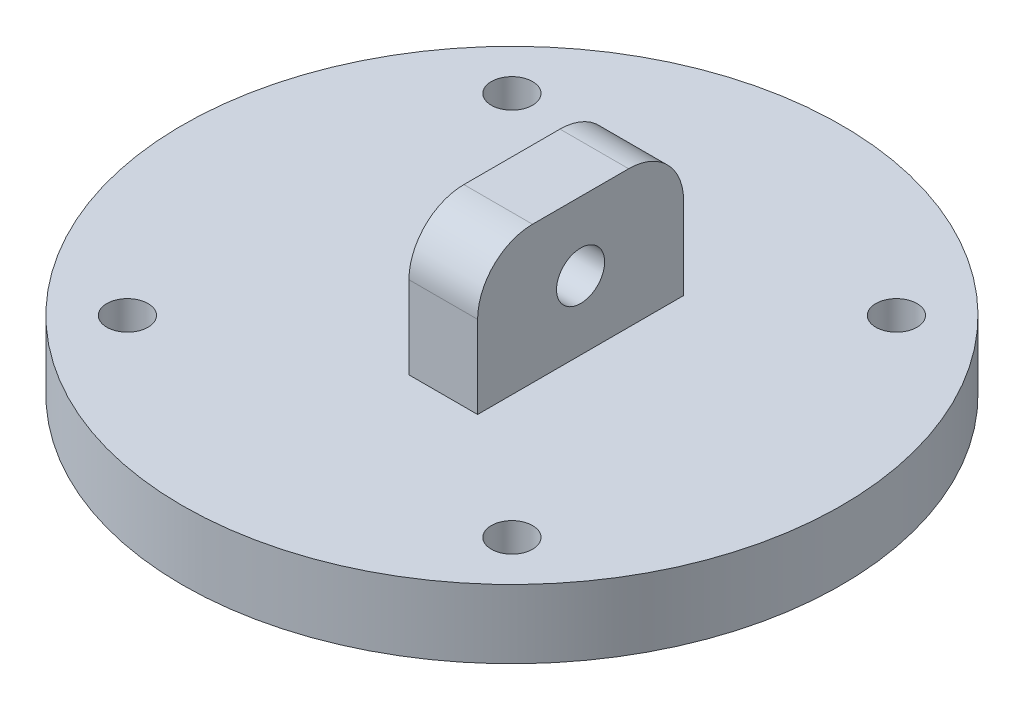
ISO-10303-21;
HEADER;
FILE_DESCRIPTION(('STEP AP214'),'2;1');
FILE_NAME('part.step','',(''),(''),'','','');
FILE_SCHEMA(('AUTOMOTIVE_DESIGN { 1 0 10303 214 1 1 1 1 }'));
ENDSEC;
DATA;
#1=APPLICATION_CONTEXT('core data for automotive mechanical design processes');
#2=APPLICATION_PROTOCOL_DEFINITION('international standard','automotive_design',2000,#1);
#3=PRODUCT_CONTEXT('',#1,'mechanical');
#4=PRODUCT('Part','Part','',(#3));
#5=PRODUCT_RELATED_PRODUCT_CATEGORY('part','',(#4));
#6=PRODUCT_DEFINITION_FORMATION('','',#4);
#7=PRODUCT_DEFINITION_CONTEXT('part definition',#1,'design');
#8=PRODUCT_DEFINITION('design','',#6,#7);
#9=PRODUCT_DEFINITION_SHAPE('','',#8);
#10=(LENGTH_UNIT() NAMED_UNIT(*) SI_UNIT(.MILLI.,.METRE.));
#11=(NAMED_UNIT(*) PLANE_ANGLE_UNIT() SI_UNIT($,.RADIAN.));
#12=(NAMED_UNIT(*) SI_UNIT($,.STERADIAN.) SOLID_ANGLE_UNIT());
#13=UNCERTAINTY_MEASURE_WITH_UNIT(LENGTH_MEASURE(1.E-05),#10,'distance_accuracy_value','');
#14=(GEOMETRIC_REPRESENTATION_CONTEXT(3) GLOBAL_UNCERTAINTY_ASSIGNED_CONTEXT((#13)) GLOBAL_UNIT_ASSIGNED_CONTEXT((#10,
#11,#12)) REPRESENTATION_CONTEXT('',''));
#15=CARTESIAN_POINT('',(0.,0.,0.));
#16=DIRECTION('',(0.,0.,1.));
#17=DIRECTION('',(1.,0.,0.));
#18=AXIS2_PLACEMENT_3D('',#15,#16,#17);
#19=CARTESIAN_POINT('',(0.,0.,0.));
#20=DIRECTION('',(0.,1.,0.));
#21=DIRECTION('',(0.,0.,1.));
#22=AXIS2_PLACEMENT_3D('',#19,#20,#21);
#23=PLANE('',#22);
#24=CARTESIAN_POINT('',(14.,0.,14.));
#25=DIRECTION('',(0.,-1.,0.));
#26=DIRECTION('',(0.,0.,-1.));
#27=AXIS2_PLACEMENT_3D('',#24,#25,#26);
#28=CIRCLE('',#27,1.49999999999999);
#29=CARTESIAN_POINT('',(14.,0.,12.5));
#30=VERTEX_POINT('',#29);
#31=EDGE_CURVE('E201',#30,#30,#28,.T.);
#32=ORIENTED_EDGE('',*,*,#31,.F.);
#33=EDGE_LOOP('',(#32));
#34=FACE_BOUND('',#33,.T.);
#35=CARTESIAN_POINT('',(0.,0.,0.));
#36=DIRECTION('',(0.,1.,0.));
#37=DIRECTION('',(0.,0.,1.));
#38=AXIS2_PLACEMENT_3D('',#35,#36,#37);
#39=CIRCLE('',#38,24.);
#40=CARTESIAN_POINT('',(0.,0.,24.));
#41=VERTEX_POINT('',#40);
#42=EDGE_CURVE('E134',#41,#41,#39,.T.);
#43=ORIENTED_EDGE('',*,*,#42,.F.);
#44=EDGE_LOOP('',(#43));
#45=FACE_BOUND('',#44,.T.);
#46=CARTESIAN_POINT('',(-14.,0.,14.));
#47=DIRECTION('',(0.,-1.,0.));
#48=DIRECTION('',(0.,0.,-1.));
#49=AXIS2_PLACEMENT_3D('',#46,#47,#48);
#50=CIRCLE('',#49,1.49999999999999);
#51=CARTESIAN_POINT('',(-14.,0.,12.5));
#52=VERTEX_POINT('',#51);
#53=EDGE_CURVE('E209',#52,#52,#50,.T.);
#54=ORIENTED_EDGE('',*,*,#53,.F.);
#55=EDGE_LOOP('',(#54));
#56=FACE_BOUND('',#55,.T.);
#57=CARTESIAN_POINT('',(-14.,0.,-14.));
#58=DIRECTION('',(0.,-1.,0.));
#59=DIRECTION('',(0.,0.,-1.));
#60=AXIS2_PLACEMENT_3D('',#57,#58,#59);
#61=CIRCLE('',#60,1.49999999999999);
#62=CARTESIAN_POINT('',(-14.,0.,-15.5));
#63=VERTEX_POINT('',#62);
#64=EDGE_CURVE('E217',#63,#63,#61,.T.);
#65=ORIENTED_EDGE('',*,*,#64,.F.);
#66=EDGE_LOOP('',(#65));
#67=FACE_BOUND('',#66,.T.);
#68=CARTESIAN_POINT('',(14.,0.,-14.));
#69=DIRECTION('',(0.,-1.,0.));
#70=DIRECTION('',(0.,0.,-1.));
#71=AXIS2_PLACEMENT_3D('',#68,#69,#70);
#72=CIRCLE('',#71,1.49999999999999);
#73=CARTESIAN_POINT('',(14.,0.,-15.5));
#74=VERTEX_POINT('',#73);
#75=EDGE_CURVE('E225',#74,#74,#72,.T.);
#76=ORIENTED_EDGE('',*,*,#75,.F.);
#77=EDGE_LOOP('',(#76));
#78=FACE_BOUND('',#77,.T.);
#79=ADVANCED_FACE('F48',(#34,#45,#56,#67,#78),#23,.F.);
#80=CARTESIAN_POINT('',(-5.,15.,-7.50000000000001));
#81=DIRECTION('',(0.,0.,1.));
#82=DIRECTION('',(1.,0.,0.));
#83=AXIS2_PLACEMENT_3D('',#80,#81,#82);
#84=PLANE('',#83);
#85=DIRECTION('',(0.,-1.,0.));
#86=VECTOR('',#85,1.);
#87=CARTESIAN_POINT('',(0.,15.,-7.50000000000001));
#88=LINE('',#87,#86);
#89=CARTESIAN_POINT('',(0.,11.,-7.50000000000001));
#90=VERTEX_POINT('',#89);
#91=CARTESIAN_POINT('',(0.,5.,-7.50000000000001));
#92=VERTEX_POINT('',#91);
#93=EDGE_CURVE('E100',#90,#92,#88,.T.);
#94=ORIENTED_EDGE('',*,*,#93,.F.);
#95=DIRECTION('',(-1.,0.,0.));
#96=VECTOR('',#95,1.);
#97=CARTESIAN_POINT('',(5.,11.,-7.5));
#98=LINE('',#97,#96);
#99=CARTESIAN_POINT('',(5.,11.,-7.5));
#100=VERTEX_POINT('',#99);
#101=EDGE_CURVE('E11',#90,#100,#98,.F.);
#102=ORIENTED_EDGE('',*,*,#101,.T.);
#103=DIRECTION('',(0.,-1.,0.));
#104=VECTOR('',#103,1.);
#105=CARTESIAN_POINT('',(5.,15.,-7.5));
#106=LINE('',#105,#104);
#107=CARTESIAN_POINT('',(5.,5.,-7.5));
#108=VERTEX_POINT('',#107);
#109=EDGE_CURVE('E127',#100,#108,#106,.T.);
#110=ORIENTED_EDGE('',*,*,#109,.T.);
#111=DIRECTION('',(1.,0.,0.));
#112=VECTOR('',#111,1.);
#113=CARTESIAN_POINT('',(0.,5.,-7.5));
#114=LINE('',#113,#112);
#115=EDGE_CURVE('E117',#92,#108,#114,.T.);
#116=ORIENTED_EDGE('',*,*,#115,.F.);
#117=EDGE_LOOP('',(#94,#102,#110,#116));
#118=FACE_BOUND('',#117,.T.);
#119=ADVANCED_FACE('F125',(#118),#84,.F.);
#120=CARTESIAN_POINT('',(-5.,15.,7.5));
#121=DIRECTION('',(0.,0.,-1.));
#122=DIRECTION('',(-1.,0.,0.));
#123=AXIS2_PLACEMENT_3D('',#120,#121,#122);
#124=PLANE('',#123);
#125=DIRECTION('',(0.,-1.,0.));
#126=VECTOR('',#125,1.);
#127=CARTESIAN_POINT('',(5.,15.,7.5));
#128=LINE('',#127,#126);
#129=CARTESIAN_POINT('',(5.,11.,7.5));
#130=VERTEX_POINT('',#129);
#131=CARTESIAN_POINT('',(5.,5.,7.5));
#132=VERTEX_POINT('',#131);
#133=EDGE_CURVE('E183',#130,#132,#128,.T.);
#134=ORIENTED_EDGE('',*,*,#133,.F.);
#135=DIRECTION('',(1.,0.,0.));
#136=VECTOR('',#135,1.);
#137=CARTESIAN_POINT('',(0.,11.,7.5));
#138=LINE('',#137,#136);
#139=CARTESIAN_POINT('',(0.,11.,7.5));
#140=VERTEX_POINT('',#139);
#141=EDGE_CURVE('E72',#130,#140,#138,.F.);
#142=ORIENTED_EDGE('',*,*,#141,.T.);
#143=DIRECTION('',(0.,1.,0.));
#144=VECTOR('',#143,1.);
#145=CARTESIAN_POINT('',(0.,15.,7.5));
#146=LINE('',#145,#144);
#147=CARTESIAN_POINT('',(0.,5.,7.5));
#148=VERTEX_POINT('',#147);
#149=EDGE_CURVE('E109',#148,#140,#146,.T.);
#150=ORIENTED_EDGE('',*,*,#149,.F.);
#151=DIRECTION('',(-1.,0.,0.));
#152=VECTOR('',#151,1.);
#153=CARTESIAN_POINT('',(0.,5.,7.5));
#154=LINE('',#153,#152);
#155=EDGE_CURVE('E120',#132,#148,#154,.T.);
#156=ORIENTED_EDGE('',*,*,#155,.F.);
#157=EDGE_LOOP('',(#134,#142,#150,#156));
#158=FACE_BOUND('',#157,.T.);
#159=ADVANCED_FACE('F185',(#158),#124,.F.);
#160=CARTESIAN_POINT('',(0.,15.,0.));
#161=DIRECTION('',(0.,1.,0.));
#162=DIRECTION('',(0.,0.,1.));
#163=AXIS2_PLACEMENT_3D('',#160,#161,#162);
#164=PLANE('',#163);
#165=DIRECTION('',(0.,0.,-1.));
#166=VECTOR('',#165,1.);
#167=CARTESIAN_POINT('',(0.,15.,-10.));
#168=LINE('',#167,#166);
#169=CARTESIAN_POINT('',(0.,15.,3.49999999999999));
#170=VERTEX_POINT('',#169);
#171=CARTESIAN_POINT('',(0.,15.,-3.5));
#172=VERTEX_POINT('',#171);
#173=EDGE_CURVE('E123',#170,#172,#168,.T.);
#174=ORIENTED_EDGE('',*,*,#173,.F.);
#175=DIRECTION('',(1.,0.,0.));
#176=VECTOR('',#175,1.);
#177=CARTESIAN_POINT('',(5.,15.,3.5));
#178=LINE('',#177,#176);
#179=CARTESIAN_POINT('',(5.,15.,3.5));
#180=VERTEX_POINT('',#179);
#181=EDGE_CURVE('E153',#170,#180,#178,.T.);
#182=ORIENTED_EDGE('',*,*,#181,.T.);
#183=DIRECTION('',(0.,0.,-1.));
#184=VECTOR('',#183,1.);
#185=CARTESIAN_POINT('',(5.,15.,-7.5));
#186=LINE('',#185,#184);
#187=CARTESIAN_POINT('',(5.,15.,-3.5));
#188=VERTEX_POINT('',#187);
#189=EDGE_CURVE('E184',#180,#188,#186,.T.);
#190=ORIENTED_EDGE('',*,*,#189,.T.);
#191=DIRECTION('',(-1.,0.,0.));
#192=VECTOR('',#191,1.);
#193=CARTESIAN_POINT('',(0.,15.,-3.5));
#194=LINE('',#193,#192);
#195=EDGE_CURVE('E143',#188,#172,#194,.T.);
#196=ORIENTED_EDGE('',*,*,#195,.T.);
#197=EDGE_LOOP('',(#174,#182,#190,#196));
#198=FACE_BOUND('',#197,.T.);
#199=ADVANCED_FACE('F173',(#198),#164,.T.);
#200=CARTESIAN_POINT('',(24.001,10.,0.));
#201=DIRECTION('',(-1.,0.,0.));
#202=DIRECTION('',(0.,0.,1.));
#203=AXIS2_PLACEMENT_3D('',#200,#201,#202);
#204=CYLINDRICAL_SURFACE('',#203,1.75);
#205=CARTESIAN_POINT('',(5.,10.,0.));
#206=DIRECTION('',(-1.,0.,0.));
#207=DIRECTION('',(0.,0.,1.));
#208=AXIS2_PLACEMENT_3D('',#205,#206,#207);
#209=CIRCLE('',#208,1.75);
#210=CARTESIAN_POINT('',(5.,10.,1.74999999999999));
#211=VERTEX_POINT('',#210);
#212=EDGE_CURVE('E108',#211,#211,#209,.F.);
#213=ORIENTED_EDGE('',*,*,#212,.T.);
#214=EDGE_LOOP('',(#213));
#215=FACE_BOUND('',#214,.T.);
#216=CARTESIAN_POINT('',(0.,10.,0.));
#217=DIRECTION('',(-1.,0.,0.));
#218=DIRECTION('',(0.,0.,1.));
#219=AXIS2_PLACEMENT_3D('',#216,#217,#218);
#220=CIRCLE('',#219,1.75);
#221=CARTESIAN_POINT('',(0.,10.,1.74999999999999));
#222=VERTEX_POINT('',#221);
#223=EDGE_CURVE('E122',#222,#222,#220,.F.);
#224=ORIENTED_EDGE('',*,*,#223,.F.);
#225=EDGE_LOOP('',(#224));
#226=FACE_BOUND('',#225,.T.);
#227=ADVANCED_FACE('F271',(#215,#226),#204,.F.);
#228=CARTESIAN_POINT('',(0.,5.,0.));
#229=DIRECTION('',(0.,1.,0.));
#230=DIRECTION('',(0.,0.,1.));
#231=AXIS2_PLACEMENT_3D('',#228,#229,#230);
#232=PLANE('',#231);
#233=CARTESIAN_POINT('',(14.,5.,-14.));
#234=DIRECTION('',(0.,1.,0.));
#235=DIRECTION('',(0.,0.,1.));
#236=AXIS2_PLACEMENT_3D('',#233,#234,#235);
#237=CIRCLE('',#236,1.49999999999999);
#238=CARTESIAN_POINT('',(14.,5.,-12.5));
#239=VERTEX_POINT('',#238);
#240=EDGE_CURVE('E221',#239,#239,#237,.T.);
#241=ORIENTED_EDGE('',*,*,#240,.F.);
#242=EDGE_LOOP('',(#241));
#243=FACE_BOUND('',#242,.T.);
#244=CARTESIAN_POINT('',(-14.,5.,-14.));
#245=DIRECTION('',(0.,1.,0.));
#246=DIRECTION('',(0.,0.,1.));
#247=AXIS2_PLACEMENT_3D('',#244,#245,#246);
#248=CIRCLE('',#247,1.49999999999999);
#249=CARTESIAN_POINT('',(-14.,5.,-12.5));
#250=VERTEX_POINT('',#249);
#251=EDGE_CURVE('E213',#250,#250,#248,.T.);
#252=ORIENTED_EDGE('',*,*,#251,.F.);
#253=EDGE_LOOP('',(#252));
#254=FACE_BOUND('',#253,.T.);
#255=CARTESIAN_POINT('',(-14.,5.,14.));
#256=DIRECTION('',(0.,1.,0.));
#257=DIRECTION('',(0.,0.,1.));
#258=AXIS2_PLACEMENT_3D('',#255,#256,#257);
#259=CIRCLE('',#258,1.49999999999999);
#260=CARTESIAN_POINT('',(-14.,5.,15.5));
#261=VERTEX_POINT('',#260);
#262=EDGE_CURVE('E205',#261,#261,#259,.T.);
#263=ORIENTED_EDGE('',*,*,#262,.F.);
#264=EDGE_LOOP('',(#263));
#265=FACE_BOUND('',#264,.T.);
#266=CARTESIAN_POINT('',(14.,5.,14.));
#267=DIRECTION('',(0.,1.,0.));
#268=DIRECTION('',(0.,0.,1.));
#269=AXIS2_PLACEMENT_3D('',#266,#267,#268);
#270=CIRCLE('',#269,1.49999999999999);
#271=CARTESIAN_POINT('',(14.,5.,15.5));
#272=VERTEX_POINT('',#271);
#273=EDGE_CURVE('E178',#272,#272,#270,.T.);
#274=ORIENTED_EDGE('',*,*,#273,.F.);
#275=EDGE_LOOP('',(#274));
#276=FACE_BOUND('',#275,.T.);
#277=DIRECTION('',(0.,0.,1.));
#278=VECTOR('',#277,1.);
#279=CARTESIAN_POINT('',(0.,5.,-10.));
#280=LINE('',#279,#278);
#281=EDGE_CURVE('E103',#92,#148,#280,.T.);
#282=ORIENTED_EDGE('',*,*,#281,.F.);
#283=ORIENTED_EDGE('',*,*,#115,.T.);
#284=DIRECTION('',(0.,0.,1.));
#285=VECTOR('',#284,1.);
#286=CARTESIAN_POINT('',(5.,5.,0.));
#287=LINE('',#286,#285);
#288=EDGE_CURVE('E129',#108,#132,#287,.T.);
#289=ORIENTED_EDGE('',*,*,#288,.T.);
#290=ORIENTED_EDGE('',*,*,#155,.T.);
#291=EDGE_LOOP('',(#282,#283,#289,#290));
#292=FACE_BOUND('',#291,.T.);
#293=CARTESIAN_POINT('',(0.,5.,0.));
#294=DIRECTION('',(0.,1.,0.));
#295=DIRECTION('',(0.,0.,1.));
#296=AXIS2_PLACEMENT_3D('',#293,#294,#295);
#297=CIRCLE('',#296,24.);
#298=CARTESIAN_POINT('',(0.,5.,24.));
#299=VERTEX_POINT('',#298);
#300=EDGE_CURVE('E139',#299,#299,#297,.T.);
#301=ORIENTED_EDGE('',*,*,#300,.T.);
#302=EDGE_LOOP('',(#301));
#303=FACE_BOUND('',#302,.T.);
#304=ADVANCED_FACE('F114',(#243,#254,#265,#276,#292,#303),#232,.T.);
#305=CARTESIAN_POINT('',(0.,5.,0.));
#306=DIRECTION('',(0.,-1.,0.));
#307=DIRECTION('',(0.,0.,-1.));
#308=AXIS2_PLACEMENT_3D('',#305,#306,#307);
#309=CYLINDRICAL_SURFACE('',#308,24.);
#310=ORIENTED_EDGE('',*,*,#300,.F.);
#311=EDGE_LOOP('',(#310));
#312=FACE_BOUND('',#311,.T.);
#313=ORIENTED_EDGE('',*,*,#42,.T.);
#314=EDGE_LOOP('',(#313));
#315=FACE_BOUND('',#314,.T.);
#316=ADVANCED_FACE('F245',(#312,#315),#309,.T.);
#317=CARTESIAN_POINT('',(5.,15.,-7.5));
#318=DIRECTION('',(-1.,0.,0.));
#319=DIRECTION('',(0.,0.,1.));
#320=AXIS2_PLACEMENT_3D('',#317,#318,#319);
#321=PLANE('',#320);
#322=ORIENTED_EDGE('',*,*,#212,.F.);
#323=EDGE_LOOP('',(#322));
#324=FACE_BOUND('',#323,.T.);
#325=ORIENTED_EDGE('',*,*,#189,.F.);
#326=CARTESIAN_POINT('',(5.,11.,3.5));
#327=DIRECTION('',(-1.,0.,0.));
#328=DIRECTION('',(0.,0.,1.));
#329=AXIS2_PLACEMENT_3D('',#326,#327,#328);
#330=CIRCLE('',#329,4.);
#331=EDGE_CURVE('E160',#180,#130,#330,.F.);
#332=ORIENTED_EDGE('',*,*,#331,.T.);
#333=ORIENTED_EDGE('',*,*,#133,.T.);
#334=ORIENTED_EDGE('',*,*,#288,.F.);
#335=ORIENTED_EDGE('',*,*,#109,.F.);
#336=CARTESIAN_POINT('',(5.,11.,-3.5));
#337=DIRECTION('',(-1.,0.,0.));
#338=DIRECTION('',(0.,0.,1.));
#339=AXIS2_PLACEMENT_3D('',#336,#337,#338);
#340=CIRCLE('',#339,4.);
#341=EDGE_CURVE('E157',#100,#188,#340,.F.);
#342=ORIENTED_EDGE('',*,*,#341,.T.);
#343=EDGE_LOOP('',(#325,#332,#333,#334,#335,#342));
#344=FACE_BOUND('',#343,.T.);
#345=ADVANCED_FACE('F182',(#324,#344),#321,.F.);
#346=CARTESIAN_POINT('',(0.,0.,0.));
#347=DIRECTION('',(-1.,0.,0.));
#348=DIRECTION('',(0.,0.,1.));
#349=AXIS2_PLACEMENT_3D('',#346,#347,#348);
#350=PLANE('',#349);
#351=ORIENTED_EDGE('',*,*,#223,.T.);
#352=EDGE_LOOP('',(#351));
#353=FACE_BOUND('',#352,.T.);
#354=ORIENTED_EDGE('',*,*,#149,.T.);
#355=CARTESIAN_POINT('',(0.,11.,3.5));
#356=DIRECTION('',(-1.,0.,0.));
#357=DIRECTION('',(0.,0.,1.));
#358=AXIS2_PLACEMENT_3D('',#355,#356,#357);
#359=CIRCLE('',#358,4.);
#360=EDGE_CURVE('E57',#140,#170,#359,.T.);
#361=ORIENTED_EDGE('',*,*,#360,.T.);
#362=ORIENTED_EDGE('',*,*,#173,.T.);
#363=CARTESIAN_POINT('',(0.,11.,-3.5));
#364=DIRECTION('',(-1.,0.,0.));
#365=DIRECTION('',(0.,0.,1.));
#366=AXIS2_PLACEMENT_3D('',#363,#364,#365);
#367=CIRCLE('',#366,4.);
#368=EDGE_CURVE('E64',#172,#90,#367,.T.);
#369=ORIENTED_EDGE('',*,*,#368,.T.);
#370=ORIENTED_EDGE('',*,*,#93,.T.);
#371=ORIENTED_EDGE('',*,*,#281,.T.);
#372=EDGE_LOOP('',(#354,#361,#362,#369,#370,#371));
#373=FACE_BOUND('',#372,.T.);
#374=ADVANCED_FACE('F102',(#353,#373),#350,.T.);
#375=CARTESIAN_POINT('',(14.,0.,14.));
#376=DIRECTION('',(0.,-1.,0.));
#377=DIRECTION('',(0.,0.,-1.));
#378=AXIS2_PLACEMENT_3D('',#375,#376,#377);
#379=CYLINDRICAL_SURFACE('',#378,1.49999999999999);
#380=ORIENTED_EDGE('',*,*,#31,.T.);
#381=EDGE_LOOP('',(#380));
#382=FACE_BOUND('',#381,.T.);
#383=ORIENTED_EDGE('',*,*,#273,.T.);
#384=EDGE_LOOP('',(#383));
#385=FACE_BOUND('',#384,.T.);
#386=ADVANCED_FACE('F263',(#382,#385),#379,.F.);
#387=CARTESIAN_POINT('',(-14.,0.,14.));
#388=DIRECTION('',(0.,-1.,0.));
#389=DIRECTION('',(0.,0.,-1.));
#390=AXIS2_PLACEMENT_3D('',#387,#388,#389);
#391=CYLINDRICAL_SURFACE('',#390,1.49999999999999);
#392=ORIENTED_EDGE('',*,*,#53,.T.);
#393=EDGE_LOOP('',(#392));
#394=FACE_BOUND('',#393,.T.);
#395=ORIENTED_EDGE('',*,*,#262,.T.);
#396=EDGE_LOOP('',(#395));
#397=FACE_BOUND('',#396,.T.);
#398=ADVANCED_FACE('F257',(#394,#397),#391,.F.);
#399=CARTESIAN_POINT('',(-14.,0.,-14.));
#400=DIRECTION('',(0.,-1.,0.));
#401=DIRECTION('',(0.,0.,-1.));
#402=AXIS2_PLACEMENT_3D('',#399,#400,#401);
#403=CYLINDRICAL_SURFACE('',#402,1.49999999999999);
#404=ORIENTED_EDGE('',*,*,#64,.T.);
#405=EDGE_LOOP('',(#404));
#406=FACE_BOUND('',#405,.T.);
#407=ORIENTED_EDGE('',*,*,#251,.T.);
#408=EDGE_LOOP('',(#407));
#409=FACE_BOUND('',#408,.T.);
#410=ADVANCED_FACE('F253',(#406,#409),#403,.F.);
#411=CARTESIAN_POINT('',(14.,0.,-14.));
#412=DIRECTION('',(0.,-1.,0.));
#413=DIRECTION('',(0.,0.,-1.));
#414=AXIS2_PLACEMENT_3D('',#411,#412,#413);
#415=CYLINDRICAL_SURFACE('',#414,1.49999999999999);
#416=ORIENTED_EDGE('',*,*,#75,.T.);
#417=EDGE_LOOP('',(#416));
#418=FACE_BOUND('',#417,.T.);
#419=ORIENTED_EDGE('',*,*,#240,.T.);
#420=EDGE_LOOP('',(#419));
#421=FACE_BOUND('',#420,.T.);
#422=ADVANCED_FACE('F231',(#418,#421),#415,.F.);
#423=CARTESIAN_POINT('',(0.,11.,3.5));
#424=DIRECTION('',(-1.,0.,0.));
#425=DIRECTION('',(0.,0.,1.));
#426=AXIS2_PLACEMENT_3D('',#423,#424,#425);
#427=CYLINDRICAL_SURFACE('',#426,4.);
#428=ORIENTED_EDGE('',*,*,#360,.F.);
#429=ORIENTED_EDGE('',*,*,#141,.F.);
#430=ORIENTED_EDGE('',*,*,#331,.F.);
#431=ORIENTED_EDGE('',*,*,#181,.F.);
#432=EDGE_LOOP('',(#428,#429,#430,#431));
#433=FACE_BOUND('',#432,.T.);
#434=ADVANCED_FACE('F180',(#433),#427,.T.);
#435=CARTESIAN_POINT('',(0.,11.,-3.5));
#436=DIRECTION('',(1.,0.,0.));
#437=DIRECTION('',(0.,0.,-1.));
#438=AXIS2_PLACEMENT_3D('',#435,#436,#437);
#439=CYLINDRICAL_SURFACE('',#438,4.);
#440=ORIENTED_EDGE('',*,*,#341,.F.);
#441=ORIENTED_EDGE('',*,*,#101,.F.);
#442=ORIENTED_EDGE('',*,*,#368,.F.);
#443=ORIENTED_EDGE('',*,*,#195,.F.);
#444=EDGE_LOOP('',(#440,#441,#442,#443));
#445=FACE_BOUND('',#444,.T.);
#446=ADVANCED_FACE('F50',(#445),#439,.T.);
#447=CLOSED_SHELL('',(#79,#119,#159,#199,#227,#304,#316,#345,#374,#386,#398,#410,#422,#434,#446));
#448=MANIFOLD_SOLID_BREP('B2',#447);
#449=ADVANCED_BREP_SHAPE_REPRESENTATION('',(#18,#448),#14);
#450=SHAPE_DEFINITION_REPRESENTATION(#9,#449);
ENDSEC;
END-ISO-10303-21;
